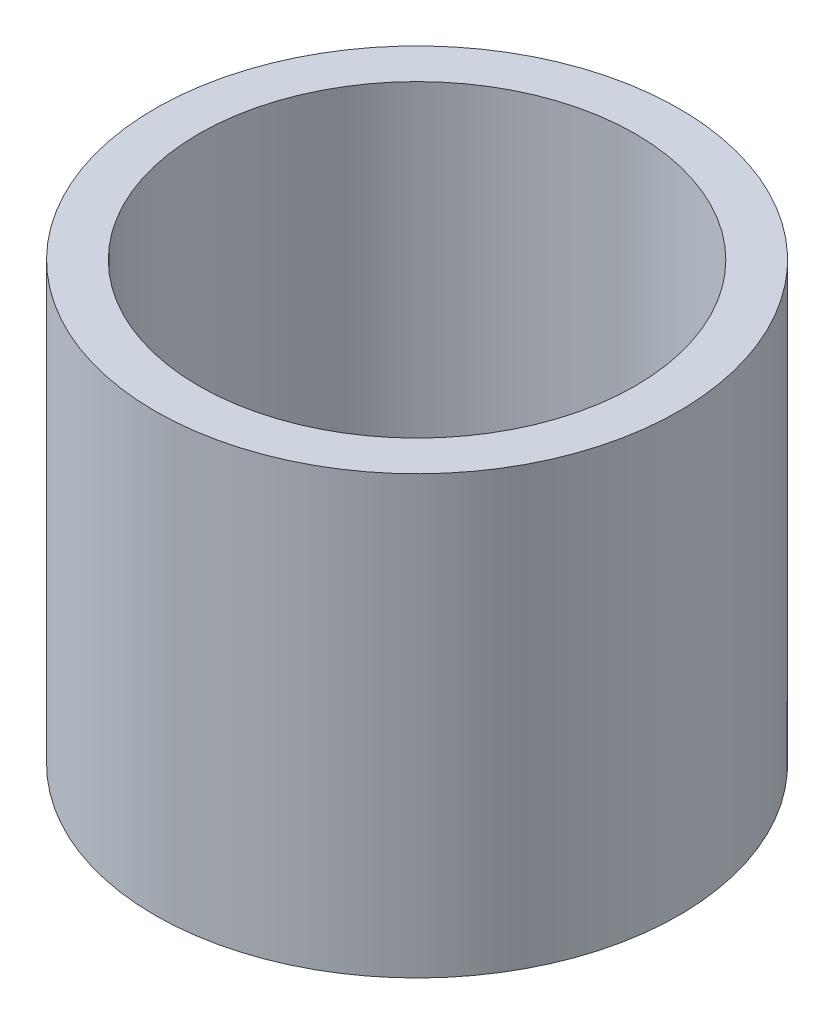
ISO-10303-21;
HEADER;
FILE_DESCRIPTION(('STEP AP214'),'2;1');
FILE_NAME('part.step','',(''),(''),'','','');
FILE_SCHEMA(('AUTOMOTIVE_DESIGN { 1 0 10303 214 1 1 1 1 }'));
ENDSEC;
DATA;
#1=APPLICATION_CONTEXT('core data for automotive mechanical design processes');
#2=APPLICATION_PROTOCOL_DEFINITION('international standard','automotive_design',2000,#1);
#3=PRODUCT_CONTEXT('',#1,'mechanical');
#4=PRODUCT('Part','Part','',(#3));
#5=PRODUCT_RELATED_PRODUCT_CATEGORY('part','',(#4));
#6=PRODUCT_DEFINITION_FORMATION('','',#4);
#7=PRODUCT_DEFINITION_CONTEXT('part definition',#1,'design');
#8=PRODUCT_DEFINITION('design','',#6,#7);
#9=PRODUCT_DEFINITION_SHAPE('','',#8);
#10=(LENGTH_UNIT() NAMED_UNIT(*) SI_UNIT(.MILLI.,.METRE.));
#11=(NAMED_UNIT(*) PLANE_ANGLE_UNIT() SI_UNIT($,.RADIAN.));
#12=(NAMED_UNIT(*) SI_UNIT($,.STERADIAN.) SOLID_ANGLE_UNIT());
#13=UNCERTAINTY_MEASURE_WITH_UNIT(LENGTH_MEASURE(1.E-05),#10,'distance_accuracy_value','');
#14=(GEOMETRIC_REPRESENTATION_CONTEXT(3) GLOBAL_UNCERTAINTY_ASSIGNED_CONTEXT((#13)) GLOBAL_UNIT_ASSIGNED_CONTEXT((#10,
#11,#12)) REPRESENTATION_CONTEXT('',''));
#15=CARTESIAN_POINT('',(0.,0.,0.));
#16=DIRECTION('',(0.,0.,1.));
#17=DIRECTION('',(1.,0.,0.));
#18=AXIS2_PLACEMENT_3D('',#15,#16,#17);
#19=CARTESIAN_POINT('',(0.,25.,0.));
#20=DIRECTION('',(0.,-1.,0.));
#21=DIRECTION('',(0.,0.,-1.));
#22=AXIS2_PLACEMENT_3D('',#19,#20,#21);
#23=CYLINDRICAL_SURFACE('',#22,25.);
#24=CARTESIAN_POINT('',(0.,25.,0.));
#25=DIRECTION('',(0.,1.,0.));
#26=DIRECTION('',(0.,0.,1.));
#27=AXIS2_PLACEMENT_3D('',#24,#25,#26);
#28=CIRCLE('',#27,25.);
#29=CARTESIAN_POINT('',(0.,25.,25.));
#30=VERTEX_POINT('',#29);
#31=EDGE_CURVE('E41',#30,#30,#28,.T.);
#32=ORIENTED_EDGE('',*,*,#31,.T.);
#33=EDGE_LOOP('',(#32));
#34=FACE_BOUND('',#33,.T.);
#35=CARTESIAN_POINT('',(0.,-15.,0.));
#36=DIRECTION('',(0.,-1.,0.));
#37=DIRECTION('',(0.,0.,-1.));
#38=AXIS2_PLACEMENT_3D('',#35,#36,#37);
#39=CIRCLE('',#38,25.);
#40=CARTESIAN_POINT('',(0.,-15.,-25.));
#41=VERTEX_POINT('',#40);
#42=EDGE_CURVE('E45',#41,#41,#39,.T.);
#43=ORIENTED_EDGE('',*,*,#42,.T.);
#44=EDGE_LOOP('',(#43));
#45=FACE_BOUND('',#44,.T.);
#46=ADVANCED_FACE('F30',(#34,#45),#23,.F.);
#47=CARTESIAN_POINT('',(0.,25.,0.));
#48=DIRECTION('',(0.,1.,0.));
#49=DIRECTION('',(0.,0.,1.));
#50=AXIS2_PLACEMENT_3D('',#47,#48,#49);
#51=PLANE('',#50);
#52=CARTESIAN_POINT('',(0.,25.,0.));
#53=DIRECTION('',(0.,1.,0.));
#54=DIRECTION('',(0.,0.,1.));
#55=AXIS2_PLACEMENT_3D('',#52,#53,#54);
#56=CIRCLE('',#55,30.);
#57=CARTESIAN_POINT('',(0.,25.,30.));
#58=VERTEX_POINT('',#57);
#59=EDGE_CURVE('E10',#58,#58,#56,.T.);
#60=ORIENTED_EDGE('',*,*,#59,.T.);
#61=EDGE_LOOP('',(#60));
#62=FACE_BOUND('',#61,.T.);
#63=ORIENTED_EDGE('',*,*,#31,.F.);
#64=EDGE_LOOP('',(#63));
#65=FACE_BOUND('',#64,.T.);
#66=ADVANCED_FACE('F60',(#62,#65),#51,.T.);
#67=CARTESIAN_POINT('',(0.,-25.,0.));
#68=DIRECTION('',(0.,1.,0.));
#69=DIRECTION('',(0.,0.,1.));
#70=AXIS2_PLACEMENT_3D('',#67,#68,#69);
#71=PLANE('',#70);
#72=CARTESIAN_POINT('',(0.,-25.,0.));
#73=DIRECTION('',(0.,1.,0.));
#74=DIRECTION('',(0.,0.,1.));
#75=AXIS2_PLACEMENT_3D('',#72,#73,#74);
#76=CIRCLE('',#75,30.);
#77=CARTESIAN_POINT('',(0.,-25.,30.));
#78=VERTEX_POINT('',#77);
#79=EDGE_CURVE('E34',#78,#78,#76,.T.);
#80=ORIENTED_EDGE('',*,*,#79,.F.);
#81=EDGE_LOOP('',(#80));
#82=FACE_BOUND('',#81,.T.);
#83=ADVANCED_FACE('F56',(#82),#71,.F.);
#84=CARTESIAN_POINT('',(0.,25.,0.));
#85=DIRECTION('',(0.,-1.,0.));
#86=DIRECTION('',(0.,0.,-1.));
#87=AXIS2_PLACEMENT_3D('',#84,#85,#86);
#88=CYLINDRICAL_SURFACE('',#87,30.);
#89=ORIENTED_EDGE('',*,*,#59,.F.);
#90=EDGE_LOOP('',(#89));
#91=FACE_BOUND('',#90,.T.);
#92=ORIENTED_EDGE('',*,*,#79,.T.);
#93=EDGE_LOOP('',(#92));
#94=FACE_BOUND('',#93,.T.);
#95=ADVANCED_FACE('F32',(#91,#94),#88,.T.);
#96=CARTESIAN_POINT('',(0.,-15.,0.));
#97=DIRECTION('',(0.,-1.,0.));
#98=DIRECTION('',(0.,0.,-1.));
#99=AXIS2_PLACEMENT_3D('',#96,#97,#98);
#100=PLANE('',#99);
#101=ORIENTED_EDGE('',*,*,#42,.F.);
#102=EDGE_LOOP('',(#101));
#103=FACE_BOUND('',#102,.T.);
#104=ADVANCED_FACE('F50',(#103),#100,.F.);
#105=CLOSED_SHELL('',(#46,#66,#83,#95,#104));
#106=MANIFOLD_SOLID_BREP('B2',#105);
#107=ADVANCED_BREP_SHAPE_REPRESENTATION('',(#18,#106),#14);
#108=SHAPE_DEFINITION_REPRESENTATION(#9,#107);
ENDSEC;
END-ISO-10303-21;
